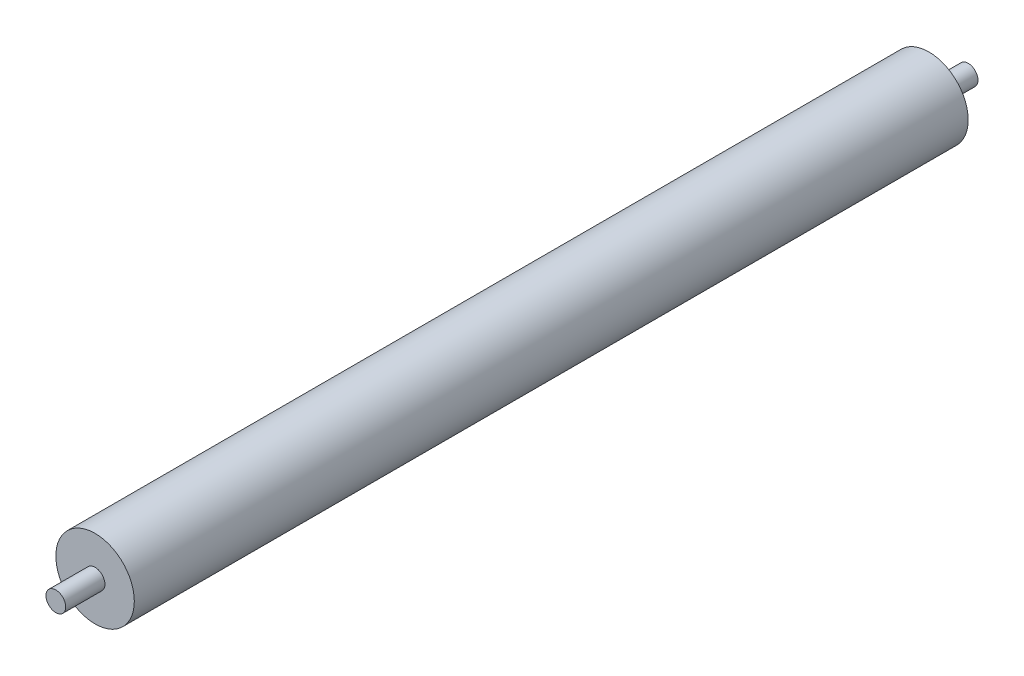
ISO-10303-21;
HEADER;
FILE_DESCRIPTION(('STEP AP214'),'2;1');
FILE_NAME('part.step','',(''),(''),'','','');
FILE_SCHEMA(('AUTOMOTIVE_DESIGN { 1 0 10303 214 1 1 1 1 }'));
ENDSEC;
DATA;
#1=APPLICATION_CONTEXT('core data for automotive mechanical design processes');
#2=APPLICATION_PROTOCOL_DEFINITION('international standard','automotive_design',2000,#1);
#3=PRODUCT_CONTEXT('',#1,'mechanical');
#4=PRODUCT('Part','Part','',(#3));
#5=PRODUCT_RELATED_PRODUCT_CATEGORY('part','',(#4));
#6=PRODUCT_DEFINITION_FORMATION('','',#4);
#7=PRODUCT_DEFINITION_CONTEXT('part definition',#1,'design');
#8=PRODUCT_DEFINITION('design','',#6,#7);
#9=PRODUCT_DEFINITION_SHAPE('','',#8);
#10=(LENGTH_UNIT() NAMED_UNIT(*) SI_UNIT(.MILLI.,.METRE.));
#11=(NAMED_UNIT(*) PLANE_ANGLE_UNIT() SI_UNIT($,.RADIAN.));
#12=(NAMED_UNIT(*) SI_UNIT($,.STERADIAN.) SOLID_ANGLE_UNIT());
#13=UNCERTAINTY_MEASURE_WITH_UNIT(LENGTH_MEASURE(1.E-05),#10,'distance_accuracy_value','');
#14=(GEOMETRIC_REPRESENTATION_CONTEXT(3) GLOBAL_UNCERTAINTY_ASSIGNED_CONTEXT((#13)) GLOBAL_UNIT_ASSIGNED_CONTEXT((#10,
#11,#12)) REPRESENTATION_CONTEXT('',''));
#15=CARTESIAN_POINT('',(0.,0.,0.));
#16=DIRECTION('',(0.,0.,1.));
#17=DIRECTION('',(1.,0.,0.));
#18=AXIS2_PLACEMENT_3D('',#15,#16,#17);
#19=CARTESIAN_POINT('',(0.,0.,590.55));
#20=DIRECTION('',(0.,0.,-1.));
#21=DIRECTION('',(-1.,0.,0.));
#22=AXIS2_PLACEMENT_3D('',#19,#20,#21);
#23=CYLINDRICAL_SURFACE('',#22,25.4);
#24=CARTESIAN_POINT('',(0.,0.,25.4));
#25=DIRECTION('',(0.,0.,1.));
#26=DIRECTION('',(1.,0.,0.));
#27=AXIS2_PLACEMENT_3D('',#24,#25,#26);
#28=CIRCLE('',#27,25.4);
#29=CARTESIAN_POINT('',(25.4,0.,25.4));
#30=VERTEX_POINT('',#29);
#31=EDGE_CURVE('E63',#30,#30,#28,.T.);
#32=ORIENTED_EDGE('',*,*,#31,.T.);
#33=EDGE_LOOP('',(#32));
#34=FACE_BOUND('',#33,.T.);
#35=CARTESIAN_POINT('',(0.,0.,565.15));
#36=DIRECTION('',(0.,0.,1.));
#37=DIRECTION('',(1.,0.,0.));
#38=AXIS2_PLACEMENT_3D('',#35,#36,#37);
#39=CIRCLE('',#38,25.4);
#40=CARTESIAN_POINT('',(25.4,0.,565.15));
#41=VERTEX_POINT('',#40);
#42=EDGE_CURVE('E65',#41,#41,#39,.T.);
#43=ORIENTED_EDGE('',*,*,#42,.F.);
#44=EDGE_LOOP('',(#43));
#45=FACE_BOUND('',#44,.T.);
#46=ADVANCED_FACE('F51',(#34,#45),#23,.T.);
#47=CARTESIAN_POINT('',(0.,0.,25.4));
#48=DIRECTION('',(0.,0.,1.));
#49=DIRECTION('',(1.,0.,0.));
#50=AXIS2_PLACEMENT_3D('',#47,#48,#49);
#51=PLANE('',#50);
#52=CARTESIAN_POINT('',(0.,0.,25.4));
#53=DIRECTION('',(0.,0.,1.));
#54=DIRECTION('',(1.,0.,0.));
#55=AXIS2_PLACEMENT_3D('',#52,#53,#54);
#56=CIRCLE('',#55,6.36193552466987);
#57=CARTESIAN_POINT('',(6.36193552466987,0.,25.4));
#58=VERTEX_POINT('',#57);
#59=EDGE_CURVE('E72',#58,#58,#56,.T.);
#60=ORIENTED_EDGE('',*,*,#59,.T.);
#61=EDGE_LOOP('',(#60));
#62=FACE_BOUND('',#61,.T.);
#63=ORIENTED_EDGE('',*,*,#31,.F.);
#64=EDGE_LOOP('',(#63));
#65=FACE_BOUND('',#64,.T.);
#66=ADVANCED_FACE('F94',(#62,#65),#51,.F.);
#67=CARTESIAN_POINT('',(0.,0.,25.4));
#68=DIRECTION('',(0.,0.,-1.));
#69=DIRECTION('',(-1.,0.,0.));
#70=AXIS2_PLACEMENT_3D('',#67,#68,#69);
#71=CYLINDRICAL_SURFACE('',#70,6.36193552466987);
#72=ORIENTED_EDGE('',*,*,#59,.F.);
#73=EDGE_LOOP('',(#72));
#74=FACE_BOUND('',#73,.T.);
#75=CARTESIAN_POINT('',(0.,0.,0.));
#76=DIRECTION('',(0.,0.,1.));
#77=DIRECTION('',(1.,0.,0.));
#78=AXIS2_PLACEMENT_3D('',#75,#76,#77);
#79=CIRCLE('',#78,6.36193552466987);
#80=CARTESIAN_POINT('',(6.36193552466987,0.,0.));
#81=VERTEX_POINT('',#80);
#82=EDGE_CURVE('E68',#81,#81,#79,.T.);
#83=ORIENTED_EDGE('',*,*,#82,.T.);
#84=EDGE_LOOP('',(#83));
#85=FACE_BOUND('',#84,.T.);
#86=ADVANCED_FACE('F100',(#74,#85),#71,.T.);
#87=CARTESIAN_POINT('',(0.,0.,0.));
#88=DIRECTION('',(0.,0.,1.));
#89=DIRECTION('',(1.,0.,0.));
#90=AXIS2_PLACEMENT_3D('',#87,#88,#89);
#91=PLANE('',#90);
#92=ORIENTED_EDGE('',*,*,#82,.F.);
#93=EDGE_LOOP('',(#92));
#94=FACE_BOUND('',#93,.T.);
#95=ADVANCED_FACE('F89',(#94),#91,.F.);
#96=CARTESIAN_POINT('',(0.,0.,565.15));
#97=DIRECTION('',(0.,0.,1.));
#98=DIRECTION('',(1.,0.,0.));
#99=AXIS2_PLACEMENT_3D('',#96,#97,#98);
#100=PLANE('',#99);
#101=CARTESIAN_POINT('',(0.,0.,565.15));
#102=DIRECTION('',(0.,0.,1.));
#103=DIRECTION('',(1.,0.,0.));
#104=AXIS2_PLACEMENT_3D('',#101,#102,#103);
#105=CIRCLE('',#104,6.37790763137687);
#106=CARTESIAN_POINT('',(6.37790763137687,0.,565.15));
#107=VERTEX_POINT('',#106);
#108=EDGE_CURVE('E69',#107,#107,#105,.T.);
#109=ORIENTED_EDGE('',*,*,#108,.F.);
#110=EDGE_LOOP('',(#109));
#111=FACE_BOUND('',#110,.T.);
#112=ORIENTED_EDGE('',*,*,#42,.T.);
#113=EDGE_LOOP('',(#112));
#114=FACE_BOUND('',#113,.T.);
#115=ADVANCED_FACE('F86',(#111,#114),#100,.T.);
#116=CARTESIAN_POINT('',(0.,0.,565.15));
#117=DIRECTION('',(0.,0.,1.));
#118=DIRECTION('',(1.,0.,0.));
#119=AXIS2_PLACEMENT_3D('',#116,#117,#118);
#120=CYLINDRICAL_SURFACE('',#119,6.37790763137687);
#121=ORIENTED_EDGE('',*,*,#108,.T.);
#122=EDGE_LOOP('',(#121));
#123=FACE_BOUND('',#122,.T.);
#124=CARTESIAN_POINT('',(0.,0.,590.55));
#125=DIRECTION('',(0.,0.,1.));
#126=DIRECTION('',(1.,0.,0.));
#127=AXIS2_PLACEMENT_3D('',#124,#125,#126);
#128=CIRCLE('',#127,6.37790763137687);
#129=CARTESIAN_POINT('',(6.37790763137687,0.,590.55));
#130=VERTEX_POINT('',#129);
#131=EDGE_CURVE('E77',#130,#130,#128,.T.);
#132=ORIENTED_EDGE('',*,*,#131,.F.);
#133=EDGE_LOOP('',(#132));
#134=FACE_BOUND('',#133,.T.);
#135=ADVANCED_FACE('F83',(#123,#134),#120,.T.);
#136=CARTESIAN_POINT('',(0.,0.,590.55));
#137=DIRECTION('',(0.,0.,1.));
#138=DIRECTION('',(1.,0.,0.));
#139=AXIS2_PLACEMENT_3D('',#136,#137,#138);
#140=PLANE('',#139);
#141=ORIENTED_EDGE('',*,*,#131,.T.);
#142=EDGE_LOOP('',(#141));
#143=FACE_BOUND('',#142,.T.);
#144=ADVANCED_FACE('F137',(#143),#140,.T.);
#145=CLOSED_SHELL('',(#46,#66,#86,#95,#115,#135,#144));
#146=CARTESIAN_POINT('',(0.,0.,590.55));
#147=DIRECTION('',(0.,0.,-1.));
#148=DIRECTION('',(-1.,0.,0.));
#149=AXIS2_PLACEMENT_3D('',#146,#147,#148);
#150=CYLINDRICAL_SURFACE('',#149,17.78);
#151=CARTESIAN_POINT('',(0.,0.,33.0200000000001));
#152=DIRECTION('',(0.,0.,1.));
#153=DIRECTION('',(1.,0.,0.));
#154=AXIS2_PLACEMENT_3D('',#151,#152,#153);
#155=CIRCLE('',#154,17.78);
#156=CARTESIAN_POINT('',(17.78,0.,33.0200000000001));
#157=VERTEX_POINT('',#156);
#158=EDGE_CURVE('E55',#157,#157,#155,.T.);
#159=ORIENTED_EDGE('',*,*,#158,.F.);
#160=EDGE_LOOP('',(#159));
#161=FACE_BOUND('',#160,.T.);
#162=CARTESIAN_POINT('',(0.,0.,557.53));
#163=DIRECTION('',(0.,0.,1.));
#164=DIRECTION('',(1.,0.,0.));
#165=AXIS2_PLACEMENT_3D('',#162,#163,#164);
#166=CIRCLE('',#165,17.78);
#167=CARTESIAN_POINT('',(17.78,0.,557.53));
#168=VERTEX_POINT('',#167);
#169=EDGE_CURVE('E12',#168,#168,#166,.T.);
#170=ORIENTED_EDGE('',*,*,#169,.T.);
#171=EDGE_LOOP('',(#170));
#172=FACE_BOUND('',#171,.T.);
#173=ADVANCED_FACE('F106',(#161,#172),#150,.F.);
#174=CARTESIAN_POINT('',(0.,0.,33.02));
#175=DIRECTION('',(0.,0.,1.));
#176=DIRECTION('',(1.,0.,0.));
#177=AXIS2_PLACEMENT_3D('',#174,#175,#176);
#178=PLANE('',#177);
#179=ORIENTED_EDGE('',*,*,#158,.T.);
#180=EDGE_LOOP('',(#179));
#181=FACE_BOUND('',#180,.T.);
#182=ADVANCED_FACE('F108',(#181),#178,.T.);
#183=CARTESIAN_POINT('',(0.,0.,557.53));
#184=DIRECTION('',(0.,0.,1.));
#185=DIRECTION('',(1.,0.,0.));
#186=AXIS2_PLACEMENT_3D('',#183,#184,#185);
#187=PLANE('',#186);
#188=ORIENTED_EDGE('',*,*,#169,.F.);
#189=EDGE_LOOP('',(#188));
#190=FACE_BOUND('',#189,.T.);
#191=ADVANCED_FACE('F53',(#190),#187,.F.);
#192=CLOSED_SHELL('',(#173,#182,#191));
#193=ORIENTED_CLOSED_SHELL('',*,#192,.T.);
#194=BREP_WITH_VOIDS('B2',#145,(#193));
#195=ADVANCED_BREP_SHAPE_REPRESENTATION('',(#18,#194),#14);
#196=SHAPE_DEFINITION_REPRESENTATION(#9,#195);
ENDSEC;
END-ISO-10303-21;
